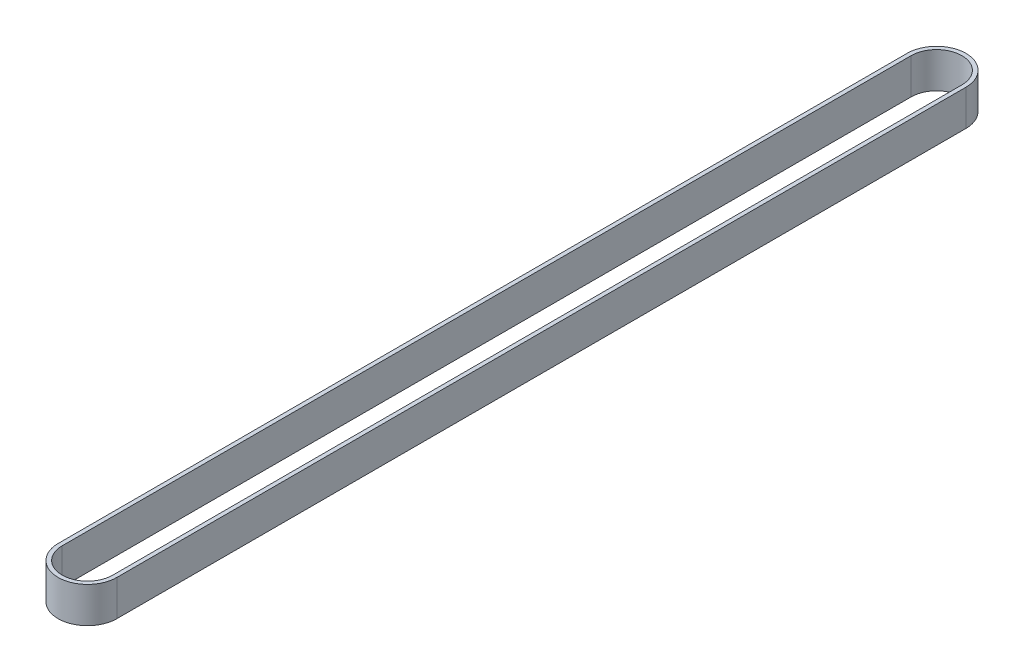
ISO-10303-21;
HEADER;
FILE_DESCRIPTION(('STEP AP214'),'2;1');
FILE_NAME('part.step','',(''),(''),'','','');
FILE_SCHEMA(('AUTOMOTIVE_DESIGN { 1 0 10303 214 1 1 1 1 }'));
ENDSEC;
DATA;
#1=APPLICATION_CONTEXT('core data for automotive mechanical design processes');
#2=APPLICATION_PROTOCOL_DEFINITION('international standard','automotive_design',2000,#1);
#3=PRODUCT_CONTEXT('',#1,'mechanical');
#4=PRODUCT('Part','Part','',(#3));
#5=PRODUCT_RELATED_PRODUCT_CATEGORY('part','',(#4));
#6=PRODUCT_DEFINITION_FORMATION('','',#4);
#7=PRODUCT_DEFINITION_CONTEXT('part definition',#1,'design');
#8=PRODUCT_DEFINITION('design','',#6,#7);
#9=PRODUCT_DEFINITION_SHAPE('','',#8);
#10=(LENGTH_UNIT() NAMED_UNIT(*) SI_UNIT(.MILLI.,.METRE.));
#11=(NAMED_UNIT(*) PLANE_ANGLE_UNIT() SI_UNIT($,.RADIAN.));
#12=(NAMED_UNIT(*) SI_UNIT($,.STERADIAN.) SOLID_ANGLE_UNIT());
#13=UNCERTAINTY_MEASURE_WITH_UNIT(LENGTH_MEASURE(1.E-05),#10,'distance_accuracy_value','');
#14=(GEOMETRIC_REPRESENTATION_CONTEXT(3) GLOBAL_UNCERTAINTY_ASSIGNED_CONTEXT((#13)) GLOBAL_UNIT_ASSIGNED_CONTEXT((#10,
#11,#12)) REPRESENTATION_CONTEXT('',''));
#15=CARTESIAN_POINT('',(0.,0.,0.));
#16=DIRECTION('',(0.,0.,1.));
#17=DIRECTION('',(1.,0.,0.));
#18=AXIS2_PLACEMENT_3D('',#15,#16,#17);
#19=CARTESIAN_POINT('',(0.,8.,-190.));
#20=DIRECTION('',(0.,1.,0.));
#21=DIRECTION('',(0.,0.,1.));
#22=AXIS2_PLACEMENT_3D('',#19,#20,#21);
#23=PLANE('',#22);
#24=CARTESIAN_POINT('',(0.,8.,-190.));
#25=DIRECTION('',(0.,1.,0.));
#26=DIRECTION('',(0.,0.,1.));
#27=AXIS2_PLACEMENT_3D('',#24,#25,#26);
#28=CIRCLE('',#27,13.1499999999999);
#29=CARTESIAN_POINT('',(13.1499999999999,8.,-190.));
#30=VERTEX_POINT('',#29);
#31=CARTESIAN_POINT('',(-13.15,8.,-190.));
#32=VERTEX_POINT('',#31);
#33=EDGE_CURVE('E135',#30,#32,#28,.T.);
#34=ORIENTED_EDGE('',*,*,#33,.T.);
#35=DIRECTION('',(0.,0.,1.));
#36=VECTOR('',#35,1.);
#37=CARTESIAN_POINT('',(-13.15,8.,-190.));
#38=LINE('',#37,#36);
#39=CARTESIAN_POINT('',(-13.15,8.,190.));
#40=VERTEX_POINT('',#39);
#41=EDGE_CURVE('E138',#32,#40,#38,.T.);
#42=ORIENTED_EDGE('',*,*,#41,.T.);
#43=CARTESIAN_POINT('',(0.,8.,190.));
#44=DIRECTION('',(0.,1.,0.));
#45=DIRECTION('',(0.,0.,1.));
#46=AXIS2_PLACEMENT_3D('',#43,#44,#45);
#47=CIRCLE('',#46,13.1499999999999);
#48=CARTESIAN_POINT('',(13.1499999999999,8.,190.));
#49=VERTEX_POINT('',#48);
#50=EDGE_CURVE('E141',#40,#49,#47,.T.);
#51=ORIENTED_EDGE('',*,*,#50,.T.);
#52=DIRECTION('',(0.,0.,-1.));
#53=VECTOR('',#52,1.);
#54=CARTESIAN_POINT('',(13.1499999999999,8.,-190.));
#55=LINE('',#54,#53);
#56=EDGE_CURVE('E143',#49,#30,#55,.T.);
#57=ORIENTED_EDGE('',*,*,#56,.T.);
#58=EDGE_LOOP('',(#34,#42,#51,#57));
#59=FACE_BOUND('',#58,.T.);
#60=DIRECTION('',(0.,0.,1.));
#61=VECTOR('',#60,1.);
#62=CARTESIAN_POINT('',(-11.3499999999999,8.,-190.));
#63=LINE('',#62,#61);
#64=CARTESIAN_POINT('',(-11.3499999999999,8.,-190.));
#65=VERTEX_POINT('',#64);
#66=CARTESIAN_POINT('',(-11.3499999999999,8.,190.));
#67=VERTEX_POINT('',#66);
#68=EDGE_CURVE('E107',#65,#67,#63,.T.);
#69=ORIENTED_EDGE('',*,*,#68,.F.);
#70=CARTESIAN_POINT('',(0.,8.,-190.));
#71=DIRECTION('',(0.,1.,0.));
#72=DIRECTION('',(0.,0.,1.));
#73=AXIS2_PLACEMENT_3D('',#70,#71,#72);
#74=CIRCLE('',#73,11.3499999999999);
#75=CARTESIAN_POINT('',(11.3499999999999,8.,-190.));
#76=VERTEX_POINT('',#75);
#77=EDGE_CURVE('E99',#76,#65,#74,.T.);
#78=ORIENTED_EDGE('',*,*,#77,.F.);
#79=DIRECTION('',(0.,0.,-1.));
#80=VECTOR('',#79,1.);
#81=CARTESIAN_POINT('',(11.3499999999999,8.,-190.));
#82=LINE('',#81,#80);
#83=CARTESIAN_POINT('',(11.3499999999999,8.,190.));
#84=VERTEX_POINT('',#83);
#85=EDGE_CURVE('E121',#84,#76,#82,.T.);
#86=ORIENTED_EDGE('',*,*,#85,.F.);
#87=CARTESIAN_POINT('',(0.,8.,190.));
#88=DIRECTION('',(0.,1.,0.));
#89=DIRECTION('',(0.,0.,1.));
#90=AXIS2_PLACEMENT_3D('',#87,#88,#89);
#91=CIRCLE('',#90,11.3499999999999);
#92=EDGE_CURVE('E119',#67,#84,#91,.T.);
#93=ORIENTED_EDGE('',*,*,#92,.F.);
#94=EDGE_LOOP('',(#69,#78,#86,#93));
#95=FACE_BOUND('',#94,.T.);
#96=ADVANCED_FACE('F34',(#59,#95),#23,.T.);
#97=CARTESIAN_POINT('',(0.,-8.,-190.));
#98=DIRECTION('',(0.,1.,0.));
#99=DIRECTION('',(0.,0.,1.));
#100=AXIS2_PLACEMENT_3D('',#97,#98,#99);
#101=PLANE('',#100);
#102=CARTESIAN_POINT('',(0.,-8.,-190.));
#103=DIRECTION('',(0.,1.,0.));
#104=DIRECTION('',(0.,0.,1.));
#105=AXIS2_PLACEMENT_3D('',#102,#103,#104);
#106=CIRCLE('',#105,13.1499999999999);
#107=CARTESIAN_POINT('',(13.1499999999999,-8.,-190.));
#108=VERTEX_POINT('',#107);
#109=CARTESIAN_POINT('',(-13.15,-8.,-190.));
#110=VERTEX_POINT('',#109);
#111=EDGE_CURVE('E115',#108,#110,#106,.T.);
#112=ORIENTED_EDGE('',*,*,#111,.F.);
#113=DIRECTION('',(0.,0.,-1.));
#114=VECTOR('',#113,1.);
#115=CARTESIAN_POINT('',(13.1499999999999,-8.,-190.));
#116=LINE('',#115,#114);
#117=CARTESIAN_POINT('',(13.1499999999999,-8.,190.));
#118=VERTEX_POINT('',#117);
#119=EDGE_CURVE('E139',#118,#108,#116,.T.);
#120=ORIENTED_EDGE('',*,*,#119,.F.);
#121=CARTESIAN_POINT('',(0.,-8.,190.));
#122=DIRECTION('',(0.,1.,0.));
#123=DIRECTION('',(0.,0.,1.));
#124=AXIS2_PLACEMENT_3D('',#121,#122,#123);
#125=CIRCLE('',#124,13.1499999999999);
#126=CARTESIAN_POINT('',(-13.15,-8.,190.));
#127=VERTEX_POINT('',#126);
#128=EDGE_CURVE('E150',#127,#118,#125,.T.);
#129=ORIENTED_EDGE('',*,*,#128,.F.);
#130=DIRECTION('',(0.,0.,1.));
#131=VECTOR('',#130,1.);
#132=CARTESIAN_POINT('',(-13.15,-8.,-190.));
#133=LINE('',#132,#131);
#134=EDGE_CURVE('E148',#110,#127,#133,.T.);
#135=ORIENTED_EDGE('',*,*,#134,.F.);
#136=EDGE_LOOP('',(#112,#120,#129,#135));
#137=FACE_BOUND('',#136,.T.);
#138=CARTESIAN_POINT('',(0.,-8.,-190.));
#139=DIRECTION('',(0.,1.,0.));
#140=DIRECTION('',(0.,0.,1.));
#141=AXIS2_PLACEMENT_3D('',#138,#139,#140);
#142=CIRCLE('',#141,11.3499999999999);
#143=CARTESIAN_POINT('',(11.3499999999999,-8.,-190.));
#144=VERTEX_POINT('',#143);
#145=CARTESIAN_POINT('',(-11.3499999999999,-8.,-190.));
#146=VERTEX_POINT('',#145);
#147=EDGE_CURVE('E57',#144,#146,#142,.T.);
#148=ORIENTED_EDGE('',*,*,#147,.T.);
#149=DIRECTION('',(0.,0.,1.));
#150=VECTOR('',#149,1.);
#151=CARTESIAN_POINT('',(-11.3499999999999,-8.,-190.));
#152=LINE('',#151,#150);
#153=CARTESIAN_POINT('',(-11.3499999999999,-8.,190.));
#154=VERTEX_POINT('',#153);
#155=EDGE_CURVE('E114',#146,#154,#152,.T.);
#156=ORIENTED_EDGE('',*,*,#155,.T.);
#157=CARTESIAN_POINT('',(0.,-8.,190.));
#158=DIRECTION('',(0.,1.,0.));
#159=DIRECTION('',(0.,0.,1.));
#160=AXIS2_PLACEMENT_3D('',#157,#158,#159);
#161=CIRCLE('',#160,11.3499999999999);
#162=CARTESIAN_POINT('',(11.3499999999999,-8.,190.));
#163=VERTEX_POINT('',#162);
#164=EDGE_CURVE('E127',#154,#163,#161,.T.);
#165=ORIENTED_EDGE('',*,*,#164,.T.);
#166=DIRECTION('',(0.,0.,-1.));
#167=VECTOR('',#166,1.);
#168=CARTESIAN_POINT('',(11.3499999999999,-8.,-190.));
#169=LINE('',#168,#167);
#170=EDGE_CURVE('E108',#163,#144,#169,.T.);
#171=ORIENTED_EDGE('',*,*,#170,.T.);
#172=EDGE_LOOP('',(#148,#156,#165,#171));
#173=FACE_BOUND('',#172,.T.);
#174=ADVANCED_FACE('F168',(#137,#173),#101,.F.);
#175=CARTESIAN_POINT('',(0.,8.,-190.));
#176=DIRECTION('',(0.,-1.,0.));
#177=DIRECTION('',(0.,0.,-1.));
#178=AXIS2_PLACEMENT_3D('',#175,#176,#177);
#179=CYLINDRICAL_SURFACE('',#178,13.1499999999999);
#180=ORIENTED_EDGE('',*,*,#111,.T.);
#181=DIRECTION('',(0.,-1.,0.));
#182=VECTOR('',#181,1.);
#183=CARTESIAN_POINT('',(-13.15,8.,-190.));
#184=LINE('',#183,#182);
#185=EDGE_CURVE('E11',#32,#110,#184,.T.);
#186=ORIENTED_EDGE('',*,*,#185,.F.);
#187=ORIENTED_EDGE('',*,*,#33,.F.);
#188=DIRECTION('',(0.,-1.,0.));
#189=VECTOR('',#188,1.);
#190=CARTESIAN_POINT('',(13.1499999999999,8.,-190.));
#191=LINE('',#190,#189);
#192=EDGE_CURVE('E145',#30,#108,#191,.T.);
#193=ORIENTED_EDGE('',*,*,#192,.T.);
#194=EDGE_LOOP('',(#180,#186,#187,#193));
#195=FACE_BOUND('',#194,.T.);
#196=ADVANCED_FACE('F36',(#195),#179,.T.);
#197=CARTESIAN_POINT('',(-13.15,8.,-190.));
#198=DIRECTION('',(1.,0.,0.));
#199=DIRECTION('',(0.,0.,-1.));
#200=AXIS2_PLACEMENT_3D('',#197,#198,#199);
#201=PLANE('',#200);
#202=ORIENTED_EDGE('',*,*,#134,.T.);
#203=DIRECTION('',(0.,-1.,0.));
#204=VECTOR('',#203,1.);
#205=CARTESIAN_POINT('',(-13.15,8.,190.));
#206=LINE('',#205,#204);
#207=EDGE_CURVE('E42',#40,#127,#206,.T.);
#208=ORIENTED_EDGE('',*,*,#207,.F.);
#209=ORIENTED_EDGE('',*,*,#41,.F.);
#210=ORIENTED_EDGE('',*,*,#185,.T.);
#211=EDGE_LOOP('',(#202,#208,#209,#210));
#212=FACE_BOUND('',#211,.T.);
#213=ADVANCED_FACE('F178',(#212),#201,.F.);
#214=CARTESIAN_POINT('',(0.,8.,190.));
#215=DIRECTION('',(0.,-1.,0.));
#216=DIRECTION('',(0.,0.,-1.));
#217=AXIS2_PLACEMENT_3D('',#214,#215,#216);
#218=CYLINDRICAL_SURFACE('',#217,13.1499999999999);
#219=ORIENTED_EDGE('',*,*,#128,.T.);
#220=DIRECTION('',(0.,-1.,0.));
#221=VECTOR('',#220,1.);
#222=CARTESIAN_POINT('',(13.1499999999999,8.,190.));
#223=LINE('',#222,#221);
#224=EDGE_CURVE('E155',#49,#118,#223,.T.);
#225=ORIENTED_EDGE('',*,*,#224,.F.);
#226=ORIENTED_EDGE('',*,*,#50,.F.);
#227=ORIENTED_EDGE('',*,*,#207,.T.);
#228=EDGE_LOOP('',(#219,#225,#226,#227));
#229=FACE_BOUND('',#228,.T.);
#230=ADVANCED_FACE('F162',(#229),#218,.T.);
#231=CARTESIAN_POINT('',(13.1499999999999,8.,-190.));
#232=DIRECTION('',(-1.,0.,0.));
#233=DIRECTION('',(0.,0.,1.));
#234=AXIS2_PLACEMENT_3D('',#231,#232,#233);
#235=PLANE('',#234);
#236=ORIENTED_EDGE('',*,*,#119,.T.);
#237=ORIENTED_EDGE('',*,*,#192,.F.);
#238=ORIENTED_EDGE('',*,*,#56,.F.);
#239=ORIENTED_EDGE('',*,*,#224,.T.);
#240=EDGE_LOOP('',(#236,#237,#238,#239));
#241=FACE_BOUND('',#240,.T.);
#242=ADVANCED_FACE('F172',(#241),#235,.F.);
#243=CARTESIAN_POINT('',(0.,8.,-190.));
#244=DIRECTION('',(0.,-1.,0.));
#245=DIRECTION('',(0.,0.,-1.));
#246=AXIS2_PLACEMENT_3D('',#243,#244,#245);
#247=CYLINDRICAL_SURFACE('',#246,11.3499999999999);
#248=ORIENTED_EDGE('',*,*,#147,.F.);
#249=DIRECTION('',(0.,-1.,0.));
#250=VECTOR('',#249,1.);
#251=CARTESIAN_POINT('',(11.3499999999999,8.,-190.));
#252=LINE('',#251,#250);
#253=EDGE_CURVE('E103',#76,#144,#252,.T.);
#254=ORIENTED_EDGE('',*,*,#253,.F.);
#255=ORIENTED_EDGE('',*,*,#77,.T.);
#256=DIRECTION('',(0.,-1.,0.));
#257=VECTOR('',#256,1.);
#258=CARTESIAN_POINT('',(-11.3499999999999,8.,-190.));
#259=LINE('',#258,#257);
#260=EDGE_CURVE('E102',#65,#146,#259,.T.);
#261=ORIENTED_EDGE('',*,*,#260,.T.);
#262=EDGE_LOOP('',(#248,#254,#255,#261));
#263=FACE_BOUND('',#262,.T.);
#264=ADVANCED_FACE('F101',(#263),#247,.F.);
#265=CARTESIAN_POINT('',(-11.3499999999999,8.,-190.));
#266=DIRECTION('',(1.,0.,0.));
#267=DIRECTION('',(0.,0.,-1.));
#268=AXIS2_PLACEMENT_3D('',#265,#266,#267);
#269=PLANE('',#268);
#270=ORIENTED_EDGE('',*,*,#155,.F.);
#271=ORIENTED_EDGE('',*,*,#260,.F.);
#272=ORIENTED_EDGE('',*,*,#68,.T.);
#273=DIRECTION('',(0.,-1.,0.));
#274=VECTOR('',#273,1.);
#275=CARTESIAN_POINT('',(-11.3499999999999,8.,190.));
#276=LINE('',#275,#274);
#277=EDGE_CURVE('E116',#67,#154,#276,.T.);
#278=ORIENTED_EDGE('',*,*,#277,.T.);
#279=EDGE_LOOP('',(#270,#271,#272,#278));
#280=FACE_BOUND('',#279,.T.);
#281=ADVANCED_FACE('F111',(#280),#269,.T.);
#282=CARTESIAN_POINT('',(0.,8.,190.));
#283=DIRECTION('',(0.,-1.,0.));
#284=DIRECTION('',(0.,0.,-1.));
#285=AXIS2_PLACEMENT_3D('',#282,#283,#284);
#286=CYLINDRICAL_SURFACE('',#285,11.3499999999999);
#287=ORIENTED_EDGE('',*,*,#164,.F.);
#288=ORIENTED_EDGE('',*,*,#277,.F.);
#289=ORIENTED_EDGE('',*,*,#92,.T.);
#290=DIRECTION('',(0.,-1.,0.));
#291=VECTOR('',#290,1.);
#292=CARTESIAN_POINT('',(11.3499999999999,8.,190.));
#293=LINE('',#292,#291);
#294=EDGE_CURVE('E49',#84,#163,#293,.T.);
#295=ORIENTED_EDGE('',*,*,#294,.T.);
#296=EDGE_LOOP('',(#287,#288,#289,#295));
#297=FACE_BOUND('',#296,.T.);
#298=ADVANCED_FACE('F201',(#297),#286,.F.);
#299=CARTESIAN_POINT('',(11.3499999999999,8.,-190.));
#300=DIRECTION('',(-1.,0.,0.));
#301=DIRECTION('',(0.,0.,1.));
#302=AXIS2_PLACEMENT_3D('',#299,#300,#301);
#303=PLANE('',#302);
#304=ORIENTED_EDGE('',*,*,#170,.F.);
#305=ORIENTED_EDGE('',*,*,#294,.F.);
#306=ORIENTED_EDGE('',*,*,#85,.T.);
#307=ORIENTED_EDGE('',*,*,#253,.T.);
#308=EDGE_LOOP('',(#304,#305,#306,#307));
#309=FACE_BOUND('',#308,.T.);
#310=ADVANCED_FACE('F205',(#309),#303,.T.);
#311=CLOSED_SHELL('',(#96,#174,#196,#213,#230,#242,#264,#281,#298,#310));
#312=MANIFOLD_SOLID_BREP('B2',#311);
#313=ADVANCED_BREP_SHAPE_REPRESENTATION('',(#18,#312),#14);
#314=SHAPE_DEFINITION_REPRESENTATION(#9,#313);
ENDSEC;
END-ISO-10303-21;
